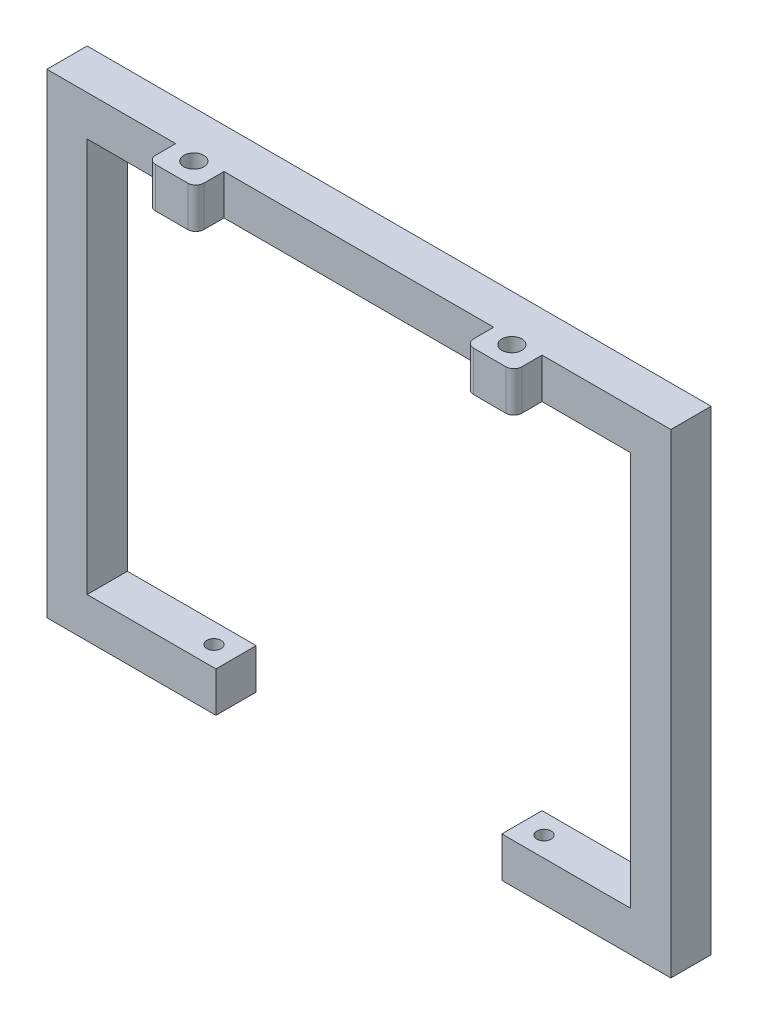
ISO-10303-21;
HEADER;
FILE_DESCRIPTION(('STEP AP214'),'2;1');
FILE_NAME('part.step','',(''),(''),'','','');
FILE_SCHEMA(('AUTOMOTIVE_DESIGN { 1 0 10303 214 1 1 1 1 }'));
ENDSEC;
DATA;
#1=APPLICATION_CONTEXT('core data for automotive mechanical design processes');
#2=APPLICATION_PROTOCOL_DEFINITION('international standard','automotive_design',2000,#1);
#3=PRODUCT_CONTEXT('',#1,'mechanical');
#4=PRODUCT('Part','Part','',(#3));
#5=PRODUCT_RELATED_PRODUCT_CATEGORY('part','',(#4));
#6=PRODUCT_DEFINITION_FORMATION('','',#4);
#7=PRODUCT_DEFINITION_CONTEXT('part definition',#1,'design');
#8=PRODUCT_DEFINITION('design','',#6,#7);
#9=PRODUCT_DEFINITION_SHAPE('','',#8);
#10=(LENGTH_UNIT() NAMED_UNIT(*) SI_UNIT(.MILLI.,.METRE.));
#11=(NAMED_UNIT(*) PLANE_ANGLE_UNIT() SI_UNIT($,.RADIAN.));
#12=(NAMED_UNIT(*) SI_UNIT($,.STERADIAN.) SOLID_ANGLE_UNIT());
#13=UNCERTAINTY_MEASURE_WITH_UNIT(LENGTH_MEASURE(1.E-05),#10,'distance_accuracy_value','');
#14=(GEOMETRIC_REPRESENTATION_CONTEXT(3) GLOBAL_UNCERTAINTY_ASSIGNED_CONTEXT((#13)) GLOBAL_UNIT_ASSIGNED_CONTEXT((#10,
#11,#12)) REPRESENTATION_CONTEXT('',''));
#15=CARTESIAN_POINT('',(0.,0.,0.));
#16=DIRECTION('',(0.,0.,1.));
#17=DIRECTION('',(1.,0.,0.));
#18=AXIS2_PLACEMENT_3D('',#15,#16,#17);
#19=CARTESIAN_POINT('',(0.,0.,10.));
#20=DIRECTION('',(0.,0.,-1.));
#21=DIRECTION('',(-1.,0.,0.));
#22=AXIS2_PLACEMENT_3D('',#19,#20,#21);
#23=PLANE('',#22);
#24=DIRECTION('',(0.,-1.,0.));
#25=VECTOR('',#24,1.);
#26=CARTESIAN_POINT('',(-10.3416428046525,73.6271966779008,10.));
#27=LINE('',#26,#25);
#28=CARTESIAN_POINT('',(-10.3416428046525,73.6271966779008,10.));
#29=VERTEX_POINT('',#28);
#30=CARTESIAN_POINT('',(-10.3416428046525,63.6271966779008,10.));
#31=VERTEX_POINT('',#30);
#32=EDGE_CURVE('E197',#29,#31,#27,.T.);
#33=ORIENTED_EDGE('',*,*,#32,.F.);
#34=DIRECTION('',(-1.,0.,0.));
#35=VECTOR('',#34,1.);
#36=CARTESIAN_POINT('',(-121.341642804653,73.6271966779008,10.));
#37=LINE('',#36,#35);
#38=CARTESIAN_POINT('',(-77.3416428046525,73.6271966779008,10.));
#39=VERTEX_POINT('',#38);
#40=EDGE_CURVE('E205',#29,#39,#37,.T.);
#41=ORIENTED_EDGE('',*,*,#40,.T.);
#42=DIRECTION('',(0.,1.,0.));
#43=VECTOR('',#42,1.);
#44=CARTESIAN_POINT('',(-77.3416428046525,73.6271966779008,10.));
#45=LINE('',#44,#43);
#46=CARTESIAN_POINT('',(-77.3416428046525,63.6271966779008,10.));
#47=VERTEX_POINT('',#46);
#48=EDGE_CURVE('E241',#47,#39,#45,.T.);
#49=ORIENTED_EDGE('',*,*,#48,.F.);
#50=DIRECTION('',(1.,0.,0.));
#51=VECTOR('',#50,1.);
#52=CARTESIAN_POINT('',(23.6583571953475,63.6271966779008,10.));
#53=LINE('',#52,#51);
#54=EDGE_CURVE('E218',#47,#31,#53,.T.);
#55=ORIENTED_EDGE('',*,*,#54,.T.);
#56=EDGE_LOOP('',(#33,#41,#49,#55));
#57=FACE_BOUND('',#56,.T.);
#58=ADVANCED_FACE('F32',(#57),#23,.F.);
#59=DIRECTION('',(0.,1.,0.));
#60=VECTOR('',#59,1.);
#61=CARTESIAN_POINT('',(1.6583571953475,73.6271966779008,10.));
#62=LINE('',#61,#60);
#63=CARTESIAN_POINT('',(1.6583571953475,63.6271966779008,10.));
#64=VERTEX_POINT('',#63);
#65=CARTESIAN_POINT('',(1.6583571953475,73.6271966779008,10.));
#66=VERTEX_POINT('',#65);
#67=EDGE_CURVE('E219',#64,#66,#62,.T.);
#68=ORIENTED_EDGE('',*,*,#67,.F.);
#69=CARTESIAN_POINT('',(23.6583571953475,63.6271966779008,10.));
#70=VERTEX_POINT('',#69);
#71=EDGE_CURVE('E314',#64,#70,#53,.T.);
#72=ORIENTED_EDGE('',*,*,#71,.T.);
#73=DIRECTION('',(0.,-1.,0.));
#74=VECTOR('',#73,1.);
#75=CARTESIAN_POINT('',(23.6583571953475,-34.3728033220992,10.));
#76=LINE('',#75,#74);
#77=CARTESIAN_POINT('',(23.6583571953475,-34.3728033220992,10.));
#78=VERTEX_POINT('',#77);
#79=EDGE_CURVE('E329',#70,#78,#76,.T.);
#80=ORIENTED_EDGE('',*,*,#79,.T.);
#81=DIRECTION('',(-1.,0.,0.));
#82=VECTOR('',#81,1.);
#83=CARTESIAN_POINT('',(-8.34164280465251,-34.3728033220992,10.));
#84=LINE('',#83,#82);
#85=CARTESIAN_POINT('',(-8.34164280465251,-34.3728033220992,10.));
#86=VERTEX_POINT('',#85);
#87=EDGE_CURVE('E418',#78,#86,#84,.T.);
#88=ORIENTED_EDGE('',*,*,#87,.T.);
#89=DIRECTION('',(0.,-1.,0.));
#90=VECTOR('',#89,1.);
#91=CARTESIAN_POINT('',(-8.34164280465251,-44.3728033220992,10.));
#92=LINE('',#91,#90);
#93=CARTESIAN_POINT('',(-8.34164280465251,-44.3728033220992,10.));
#94=VERTEX_POINT('',#93);
#95=EDGE_CURVE('E415',#86,#94,#92,.T.);
#96=ORIENTED_EDGE('',*,*,#95,.T.);
#97=DIRECTION('',(1.,0.,0.));
#98=VECTOR('',#97,1.);
#99=CARTESIAN_POINT('',(33.6583571953475,-44.3728033220992,10.));
#100=LINE('',#99,#98);
#101=CARTESIAN_POINT('',(33.6583571953475,-44.3728033220992,10.));
#102=VERTEX_POINT('',#101);
#103=EDGE_CURVE('E412',#94,#102,#100,.T.);
#104=ORIENTED_EDGE('',*,*,#103,.T.);
#105=DIRECTION('',(0.,1.,0.));
#106=VECTOR('',#105,1.);
#107=CARTESIAN_POINT('',(33.6583571953475,73.6271966779008,10.));
#108=LINE('',#107,#106);
#109=CARTESIAN_POINT('',(33.6583571953475,73.6271966779008,10.));
#110=VERTEX_POINT('',#109);
#111=EDGE_CURVE('E404',#102,#110,#108,.T.);
#112=ORIENTED_EDGE('',*,*,#111,.T.);
#113=EDGE_CURVE('E213',#110,#66,#37,.T.);
#114=ORIENTED_EDGE('',*,*,#113,.T.);
#115=EDGE_LOOP('',(#68,#72,#80,#88,#96,#104,#112,#114));
#116=FACE_BOUND('',#115,.T.);
#117=ADVANCED_FACE('F313',(#116),#23,.F.);
#118=DIRECTION('',(0.,-1.,0.));
#119=VECTOR('',#118,1.);
#120=CARTESIAN_POINT('',(-89.3416428046525,73.6271966779008,10.));
#121=LINE('',#120,#119);
#122=CARTESIAN_POINT('',(-89.3416428046525,73.6271966779008,10.));
#123=VERTEX_POINT('',#122);
#124=CARTESIAN_POINT('',(-89.3416428046525,63.6271966779008,10.));
#125=VERTEX_POINT('',#124);
#126=EDGE_CURVE('E236',#123,#125,#121,.T.);
#127=ORIENTED_EDGE('',*,*,#126,.F.);
#128=CARTESIAN_POINT('',(-121.341642804653,73.6271966779008,10.));
#129=VERTEX_POINT('',#128);
#130=EDGE_CURVE('E214',#123,#129,#37,.T.);
#131=ORIENTED_EDGE('',*,*,#130,.T.);
#132=DIRECTION('',(0.,-1.,0.));
#133=VECTOR('',#132,1.);
#134=CARTESIAN_POINT('',(-121.341642804653,-44.3728033220992,10.));
#135=LINE('',#134,#133);
#136=CARTESIAN_POINT('',(-121.341642804653,-44.3728033220992,10.));
#137=VERTEX_POINT('',#136);
#138=EDGE_CURVE('E401',#129,#137,#135,.T.);
#139=ORIENTED_EDGE('',*,*,#138,.T.);
#140=DIRECTION('',(1.,0.,0.));
#141=VECTOR('',#140,1.);
#142=CARTESIAN_POINT('',(-79.3416428046525,-44.3728033220992,10.));
#143=LINE('',#142,#141);
#144=CARTESIAN_POINT('',(-79.3416428046525,-44.3728033220992,10.));
#145=VERTEX_POINT('',#144);
#146=EDGE_CURVE('E399',#137,#145,#143,.T.);
#147=ORIENTED_EDGE('',*,*,#146,.T.);
#148=DIRECTION('',(0.,1.,0.));
#149=VECTOR('',#148,1.);
#150=CARTESIAN_POINT('',(-79.3416428046525,-34.3728033220992,10.));
#151=LINE('',#150,#149);
#152=CARTESIAN_POINT('',(-79.3416428046525,-34.3728033220992,10.));
#153=VERTEX_POINT('',#152);
#154=EDGE_CURVE('E371',#145,#153,#151,.T.);
#155=ORIENTED_EDGE('',*,*,#154,.T.);
#156=DIRECTION('',(-1.,0.,0.));
#157=VECTOR('',#156,1.);
#158=CARTESIAN_POINT('',(-111.341642804653,-34.3728033220992,10.));
#159=LINE('',#158,#157);
#160=CARTESIAN_POINT('',(-111.341642804653,-34.3728033220992,10.));
#161=VERTEX_POINT('',#160);
#162=EDGE_CURVE('E322',#153,#161,#159,.T.);
#163=ORIENTED_EDGE('',*,*,#162,.T.);
#164=DIRECTION('',(0.,1.,0.));
#165=VECTOR('',#164,1.);
#166=CARTESIAN_POINT('',(-111.341642804653,63.6271966779008,10.));
#167=LINE('',#166,#165);
#168=CARTESIAN_POINT('',(-111.341642804653,63.6271966779008,10.));
#169=VERTEX_POINT('',#168);
#170=EDGE_CURVE('E319',#161,#169,#167,.T.);
#171=ORIENTED_EDGE('',*,*,#170,.T.);
#172=EDGE_CURVE('E320',#169,#125,#53,.T.);
#173=ORIENTED_EDGE('',*,*,#172,.T.);
#174=EDGE_LOOP('',(#127,#131,#139,#147,#155,#163,#171,#173));
#175=FACE_BOUND('',#174,.T.);
#176=ADVANCED_FACE('F456',(#175),#23,.F.);
#177=CARTESIAN_POINT('',(-111.341642804653,-34.3728033220992,10.));
#178=DIRECTION('',(0.,-1.,0.));
#179=DIRECTION('',(0.,0.,-1.));
#180=AXIS2_PLACEMENT_3D('',#177,#178,#179);
#181=PLANE('',#180);
#182=CARTESIAN_POINT('',(-84.8416428046525,-34.3728033220992,5.));
#183=DIRECTION('',(0.,1.,0.));
#184=DIRECTION('',(0.,0.,1.));
#185=AXIS2_PLACEMENT_3D('',#182,#183,#184);
#186=CIRCLE('',#185,1.775);
#187=CARTESIAN_POINT('',(-84.8416428046525,-34.3728033220992,6.775));
#188=VERTEX_POINT('',#187);
#189=EDGE_CURVE('E466',#188,#188,#186,.T.);
#190=ORIENTED_EDGE('',*,*,#189,.F.);
#191=EDGE_LOOP('',(#190));
#192=FACE_BOUND('',#191,.T.);
#193=DIRECTION('',(-1.,0.,0.));
#194=VECTOR('',#193,1.);
#195=CARTESIAN_POINT('',(-111.341642804653,-34.3728033220992,0.));
#196=LINE('',#195,#194);
#197=CARTESIAN_POINT('',(-79.3416428046525,-34.3728033220992,0.));
#198=VERTEX_POINT('',#197);
#199=CARTESIAN_POINT('',(-111.341642804653,-34.3728033220992,0.));
#200=VERTEX_POINT('',#199);
#201=EDGE_CURVE('E394',#198,#200,#196,.T.);
#202=ORIENTED_EDGE('',*,*,#201,.T.);
#203=DIRECTION('',(0.,0.,-1.));
#204=VECTOR('',#203,1.);
#205=CARTESIAN_POINT('',(-111.341642804653,-34.3728033220992,10.));
#206=LINE('',#205,#204);
#207=EDGE_CURVE('E337',#161,#200,#206,.T.);
#208=ORIENTED_EDGE('',*,*,#207,.F.);
#209=ORIENTED_EDGE('',*,*,#162,.F.);
#210=DIRECTION('',(0.,0.,-1.));
#211=VECTOR('',#210,1.);
#212=CARTESIAN_POINT('',(-79.3416428046525,-34.3728033220992,10.));
#213=LINE('',#212,#211);
#214=EDGE_CURVE('E368',#153,#198,#213,.T.);
#215=ORIENTED_EDGE('',*,*,#214,.T.);
#216=EDGE_LOOP('',(#202,#208,#209,#215));
#217=FACE_BOUND('',#216,.T.);
#218=ADVANCED_FACE('F464',(#192,#217),#181,.F.);
#219=CARTESIAN_POINT('',(-111.341642804653,63.6271966779008,10.));
#220=DIRECTION('',(-1.,0.,0.));
#221=DIRECTION('',(0.,0.,1.));
#222=AXIS2_PLACEMENT_3D('',#219,#220,#221);
#223=PLANE('',#222);
#224=DIRECTION('',(0.,1.,0.));
#225=VECTOR('',#224,1.);
#226=CARTESIAN_POINT('',(-111.341642804653,63.6271966779008,0.));
#227=LINE('',#226,#225);
#228=CARTESIAN_POINT('',(-111.341642804653,63.6271966779008,0.));
#229=VERTEX_POINT('',#228);
#230=EDGE_CURVE('E392',#200,#229,#227,.T.);
#231=ORIENTED_EDGE('',*,*,#230,.T.);
#232=DIRECTION('',(0.,0.,-1.));
#233=VECTOR('',#232,1.);
#234=CARTESIAN_POINT('',(-111.341642804653,63.6271966779008,10.));
#235=LINE('',#234,#233);
#236=EDGE_CURVE('E340',#169,#229,#235,.T.);
#237=ORIENTED_EDGE('',*,*,#236,.F.);
#238=ORIENTED_EDGE('',*,*,#170,.F.);
#239=ORIENTED_EDGE('',*,*,#207,.T.);
#240=EDGE_LOOP('',(#231,#237,#238,#239));
#241=FACE_BOUND('',#240,.T.);
#242=ADVANCED_FACE('F504',(#241),#223,.F.);
#243=CARTESIAN_POINT('',(23.6583571953475,63.6271966779008,10.));
#244=DIRECTION('',(0.,1.,0.));
#245=DIRECTION('',(0.,0.,1.));
#246=AXIS2_PLACEMENT_3D('',#243,#244,#245);
#247=PLANE('',#246);
#248=CARTESIAN_POINT('',(-4.34164280465249,63.6271966779008,11.5));
#249=DIRECTION('',(0.,1.,0.));
#250=DIRECTION('',(0.,0.,1.));
#251=AXIS2_PLACEMENT_3D('',#248,#249,#250);
#252=CIRCLE('',#251,2.47979840310108);
#253=CARTESIAN_POINT('',(-4.34164280465249,63.6271966779008,13.9797984031011));
#254=VERTEX_POINT('',#253);
#255=EDGE_CURVE('E760',#254,#254,#252,.F.);
#256=ORIENTED_EDGE('',*,*,#255,.F.);
#257=EDGE_LOOP('',(#256));
#258=FACE_BOUND('',#257,.T.);
#259=CARTESIAN_POINT('',(-83.3416428046525,63.6271966779008,11.5));
#260=DIRECTION('',(0.,1.,0.));
#261=DIRECTION('',(0.,0.,1.));
#262=AXIS2_PLACEMENT_3D('',#259,#260,#261);
#263=CIRCLE('',#262,2.47979840310108);
#264=CARTESIAN_POINT('',(-83.3416428046525,63.6271966779008,13.9797984031011));
#265=VERTEX_POINT('',#264);
#266=EDGE_CURVE('E220',#265,#265,#263,.F.);
#267=ORIENTED_EDGE('',*,*,#266,.F.);
#268=EDGE_LOOP('',(#267));
#269=FACE_BOUND('',#268,.T.);
#270=DIRECTION('',(0.,0.,-1.));
#271=VECTOR('',#270,1.);
#272=CARTESIAN_POINT('',(1.6583571953475,63.6271966779008,17.));
#273=LINE('',#272,#271);
#274=CARTESIAN_POINT('',(1.6583571953475,63.6271966779008,15.));
#275=VERTEX_POINT('',#274);
#276=EDGE_CURVE('E232',#275,#64,#273,.T.);
#277=ORIENTED_EDGE('',*,*,#276,.F.);
#278=CARTESIAN_POINT('',(-0.341642804652501,63.6271966779008,15.));
#279=DIRECTION('',(0.,1.,0.));
#280=DIRECTION('',(0.,0.,1.));
#281=AXIS2_PLACEMENT_3D('',#278,#279,#280);
#282=CIRCLE('',#281,2.);
#283=CARTESIAN_POINT('',(-0.341642804652501,63.6271966779008,17.));
#284=VERTEX_POINT('',#283);
#285=EDGE_CURVE('E40',#275,#284,#282,.F.);
#286=ORIENTED_EDGE('',*,*,#285,.T.);
#287=DIRECTION('',(1.,0.,0.));
#288=VECTOR('',#287,1.);
#289=CARTESIAN_POINT('',(-10.3416428046525,63.6271966779008,17.));
#290=LINE('',#289,#288);
#291=CARTESIAN_POINT('',(-8.3416428046525,63.6271966779008,17.));
#292=VERTEX_POINT('',#291);
#293=EDGE_CURVE('E223',#292,#284,#290,.T.);
#294=ORIENTED_EDGE('',*,*,#293,.F.);
#295=CARTESIAN_POINT('',(-8.3416428046525,63.6271966779008,15.));
#296=DIRECTION('',(0.,1.,0.));
#297=DIRECTION('',(0.,0.,1.));
#298=AXIS2_PLACEMENT_3D('',#295,#296,#297);
#299=CIRCLE('',#298,2.);
#300=CARTESIAN_POINT('',(-10.3416428046525,63.6271966779008,15.));
#301=VERTEX_POINT('',#300);
#302=EDGE_CURVE('E47',#292,#301,#299,.F.);
#303=ORIENTED_EDGE('',*,*,#302,.T.);
#304=DIRECTION('',(0.,0.,-1.));
#305=VECTOR('',#304,1.);
#306=CARTESIAN_POINT('',(-10.3416428046525,63.6271966779008,17.));
#307=LINE('',#306,#305);
#308=EDGE_CURVE('E234',#301,#31,#307,.T.);
#309=ORIENTED_EDGE('',*,*,#308,.T.);
#310=ORIENTED_EDGE('',*,*,#54,.F.);
#311=DIRECTION('',(0.,0.,-1.));
#312=VECTOR('',#311,1.);
#313=CARTESIAN_POINT('',(-77.3416428046525,63.6271966779008,17.));
#314=LINE('',#313,#312);
#315=CARTESIAN_POINT('',(-77.3416428046525,63.6271966779008,15.));
#316=VERTEX_POINT('',#315);
#317=EDGE_CURVE('E265',#316,#47,#314,.T.);
#318=ORIENTED_EDGE('',*,*,#317,.F.);
#319=CARTESIAN_POINT('',(-79.3416428046525,63.6271966779008,15.));
#320=DIRECTION('',(0.,1.,0.));
#321=DIRECTION('',(0.,0.,1.));
#322=AXIS2_PLACEMENT_3D('',#319,#320,#321);
#323=CIRCLE('',#322,2.);
#324=CARTESIAN_POINT('',(-79.3416428046525,63.6271966779008,17.));
#325=VERTEX_POINT('',#324);
#326=EDGE_CURVE('E282',#316,#325,#323,.F.);
#327=ORIENTED_EDGE('',*,*,#326,.T.);
#328=DIRECTION('',(1.,0.,0.));
#329=VECTOR('',#328,1.);
#330=CARTESIAN_POINT('',(-89.3416428046525,63.6271966779008,17.));
#331=LINE('',#330,#329);
#332=CARTESIAN_POINT('',(-87.3416428046525,63.6271966779008,17.));
#333=VERTEX_POINT('',#332);
#334=EDGE_CURVE('E237',#333,#325,#331,.T.);
#335=ORIENTED_EDGE('',*,*,#334,.F.);
#336=CARTESIAN_POINT('',(-87.3416428046525,63.6271966779008,15.));
#337=DIRECTION('',(0.,1.,0.));
#338=DIRECTION('',(0.,0.,1.));
#339=AXIS2_PLACEMENT_3D('',#336,#337,#338);
#340=CIRCLE('',#339,2.);
#341=CARTESIAN_POINT('',(-89.3416428046525,63.6271966779008,15.));
#342=VERTEX_POINT('',#341);
#343=EDGE_CURVE('E278',#333,#342,#340,.F.);
#344=ORIENTED_EDGE('',*,*,#343,.T.);
#345=DIRECTION('',(0.,0.,-1.));
#346=VECTOR('',#345,1.);
#347=CARTESIAN_POINT('',(-89.3416428046525,63.6271966779008,17.));
#348=LINE('',#347,#346);
#349=EDGE_CURVE('E274',#342,#125,#348,.T.);
#350=ORIENTED_EDGE('',*,*,#349,.T.);
#351=ORIENTED_EDGE('',*,*,#172,.F.);
#352=ORIENTED_EDGE('',*,*,#236,.T.);
#353=DIRECTION('',(1.,0.,0.));
#354=VECTOR('',#353,1.);
#355=CARTESIAN_POINT('',(23.6583571953475,63.6271966779008,0.));
#356=LINE('',#355,#354);
#357=CARTESIAN_POINT('',(23.6583571953475,63.6271966779008,0.));
#358=VERTEX_POINT('',#357);
#359=EDGE_CURVE('E390',#229,#358,#356,.T.);
#360=ORIENTED_EDGE('',*,*,#359,.T.);
#361=DIRECTION('',(0.,0.,-1.));
#362=VECTOR('',#361,1.);
#363=CARTESIAN_POINT('',(23.6583571953475,63.6271966779008,10.));
#364=LINE('',#363,#362);
#365=EDGE_CURVE('E317',#70,#358,#364,.T.);
#366=ORIENTED_EDGE('',*,*,#365,.F.);
#367=ORIENTED_EDGE('',*,*,#71,.F.);
#368=EDGE_LOOP('',(#277,#286,#294,#303,#309,#310,#318,#327,#335,#344,#350,#351,#352,#360,#366,#367));
#369=FACE_BOUND('',#368,.T.);
#370=ADVANCED_FACE('F299',(#258,#269,#369),#247,.F.);
#371=CARTESIAN_POINT('',(23.6583571953475,-34.3728033220992,10.));
#372=DIRECTION('',(1.,0.,0.));
#373=DIRECTION('',(0.,0.,-1.));
#374=AXIS2_PLACEMENT_3D('',#371,#372,#373);
#375=PLANE('',#374);
#376=DIRECTION('',(0.,-1.,0.));
#377=VECTOR('',#376,1.);
#378=CARTESIAN_POINT('',(23.6583571953475,-34.3728033220992,0.));
#379=LINE('',#378,#377);
#380=CARTESIAN_POINT('',(23.6583571953475,-34.3728033220992,0.));
#381=VERTEX_POINT('',#380);
#382=EDGE_CURVE('E388',#358,#381,#379,.T.);
#383=ORIENTED_EDGE('',*,*,#382,.T.);
#384=DIRECTION('',(0.,0.,-1.));
#385=VECTOR('',#384,1.);
#386=CARTESIAN_POINT('',(23.6583571953475,-34.3728033220992,10.));
#387=LINE('',#386,#385);
#388=EDGE_CURVE('E344',#78,#381,#387,.T.);
#389=ORIENTED_EDGE('',*,*,#388,.F.);
#390=ORIENTED_EDGE('',*,*,#79,.F.);
#391=ORIENTED_EDGE('',*,*,#365,.T.);
#392=EDGE_LOOP('',(#383,#389,#390,#391));
#393=FACE_BOUND('',#392,.T.);
#394=ADVANCED_FACE('F424',(#393),#375,.F.);
#395=CARTESIAN_POINT('',(-8.34164280465251,-34.3728033220992,10.));
#396=DIRECTION('',(0.,-1.,0.));
#397=DIRECTION('',(0.,0.,-1.));
#398=AXIS2_PLACEMENT_3D('',#395,#396,#397);
#399=PLANE('',#398);
#400=CARTESIAN_POINT('',(-2.8416428046525,-34.3728033220992,5.));
#401=DIRECTION('',(0.,1.,0.));
#402=DIRECTION('',(0.,0.,1.));
#403=AXIS2_PLACEMENT_3D('',#400,#401,#402);
#404=CIRCLE('',#403,1.775);
#405=CARTESIAN_POINT('',(-2.8416428046525,-34.3728033220992,6.775));
#406=VERTEX_POINT('',#405);
#407=EDGE_CURVE('E280',#406,#406,#404,.T.);
#408=ORIENTED_EDGE('',*,*,#407,.F.);
#409=EDGE_LOOP('',(#408));
#410=FACE_BOUND('',#409,.T.);
#411=DIRECTION('',(-1.,0.,0.));
#412=VECTOR('',#411,1.);
#413=CARTESIAN_POINT('',(-8.34164280465251,-34.3728033220992,0.));
#414=LINE('',#413,#412);
#415=CARTESIAN_POINT('',(-8.34164280465251,-34.3728033220992,0.));
#416=VERTEX_POINT('',#415);
#417=EDGE_CURVE('E386',#381,#416,#414,.T.);
#418=ORIENTED_EDGE('',*,*,#417,.T.);
#419=DIRECTION('',(0.,0.,-1.));
#420=VECTOR('',#419,1.);
#421=CARTESIAN_POINT('',(-8.34164280465251,-34.3728033220992,10.));
#422=LINE('',#421,#420);
#423=EDGE_CURVE('E347',#86,#416,#422,.T.);
#424=ORIENTED_EDGE('',*,*,#423,.F.);
#425=ORIENTED_EDGE('',*,*,#87,.F.);
#426=ORIENTED_EDGE('',*,*,#388,.T.);
#427=EDGE_LOOP('',(#418,#424,#425,#426));
#428=FACE_BOUND('',#427,.T.);
#429=ADVANCED_FACE('F428',(#410,#428),#399,.F.);
#430=CARTESIAN_POINT('',(-8.34164280465251,-44.3728033220992,10.));
#431=DIRECTION('',(1.,0.,0.));
#432=DIRECTION('',(0.,0.,-1.));
#433=AXIS2_PLACEMENT_3D('',#430,#431,#432);
#434=PLANE('',#433);
#435=DIRECTION('',(0.,-1.,0.));
#436=VECTOR('',#435,1.);
#437=CARTESIAN_POINT('',(-8.34164280465251,-44.3728033220992,0.));
#438=LINE('',#437,#436);
#439=CARTESIAN_POINT('',(-8.34164280465251,-44.3728033220992,0.));
#440=VERTEX_POINT('',#439);
#441=EDGE_CURVE('E384',#416,#440,#438,.T.);
#442=ORIENTED_EDGE('',*,*,#441,.T.);
#443=DIRECTION('',(0.,0.,-1.));
#444=VECTOR('',#443,1.);
#445=CARTESIAN_POINT('',(-8.34164280465251,-44.3728033220992,10.));
#446=LINE('',#445,#444);
#447=EDGE_CURVE('E350',#94,#440,#446,.T.);
#448=ORIENTED_EDGE('',*,*,#447,.F.);
#449=ORIENTED_EDGE('',*,*,#95,.F.);
#450=ORIENTED_EDGE('',*,*,#423,.T.);
#451=EDGE_LOOP('',(#442,#448,#449,#450));
#452=FACE_BOUND('',#451,.T.);
#453=ADVANCED_FACE('F433',(#452),#434,.F.);
#454=CARTESIAN_POINT('',(33.6583571953475,-44.3728033220992,10.));
#455=DIRECTION('',(0.,1.,0.));
#456=DIRECTION('',(0.,0.,1.));
#457=AXIS2_PLACEMENT_3D('',#454,#455,#456);
#458=PLANE('',#457);
#459=CARTESIAN_POINT('',(-2.8416428046525,-44.3728033220992,5.));
#460=DIRECTION('',(0.,1.,0.));
#461=DIRECTION('',(0.,0.,1.));
#462=AXIS2_PLACEMENT_3D('',#459,#460,#461);
#463=CIRCLE('',#462,1.775);
#464=CARTESIAN_POINT('',(-2.8416428046525,-44.3728033220992,6.775));
#465=VERTEX_POINT('',#464);
#466=EDGE_CURVE('E469',#465,#465,#463,.T.);
#467=ORIENTED_EDGE('',*,*,#466,.T.);
#468=EDGE_LOOP('',(#467));
#469=FACE_BOUND('',#468,.T.);
#470=DIRECTION('',(1.,0.,0.));
#471=VECTOR('',#470,1.);
#472=CARTESIAN_POINT('',(33.6583571953475,-44.3728033220992,0.));
#473=LINE('',#472,#471);
#474=CARTESIAN_POINT('',(33.6583571953475,-44.3728033220992,0.));
#475=VERTEX_POINT('',#474);
#476=EDGE_CURVE('E382',#440,#475,#473,.T.);
#477=ORIENTED_EDGE('',*,*,#476,.T.);
#478=DIRECTION('',(0.,0.,-1.));
#479=VECTOR('',#478,1.);
#480=CARTESIAN_POINT('',(33.6583571953475,-44.3728033220992,10.));
#481=LINE('',#480,#479);
#482=EDGE_CURVE('E353',#102,#475,#481,.T.);
#483=ORIENTED_EDGE('',*,*,#482,.F.);
#484=ORIENTED_EDGE('',*,*,#103,.F.);
#485=ORIENTED_EDGE('',*,*,#447,.T.);
#486=EDGE_LOOP('',(#477,#483,#484,#485));
#487=FACE_BOUND('',#486,.T.);
#488=ADVANCED_FACE('F436',(#469,#487),#458,.F.);
#489=CARTESIAN_POINT('',(33.6583571953475,73.6271966779008,10.));
#490=DIRECTION('',(-1.,0.,0.));
#491=DIRECTION('',(0.,-1.,0.));
#492=AXIS2_PLACEMENT_3D('',#489,#490,#491);
#493=PLANE('',#492);
#494=DIRECTION('',(0.,1.,0.));
#495=VECTOR('',#494,1.);
#496=CARTESIAN_POINT('',(33.6583571953475,73.6271966779008,0.));
#497=LINE('',#496,#495);
#498=CARTESIAN_POINT('',(33.6583571953475,73.6271966779008,0.));
#499=VERTEX_POINT('',#498);
#500=EDGE_CURVE('E380',#475,#499,#497,.T.);
#501=ORIENTED_EDGE('',*,*,#500,.T.);
#502=DIRECTION('',(0.,0.,-1.));
#503=VECTOR('',#502,1.);
#504=CARTESIAN_POINT('',(33.6583571953475,73.6271966779008,10.));
#505=LINE('',#504,#503);
#506=EDGE_CURVE('E356',#110,#499,#505,.T.);
#507=ORIENTED_EDGE('',*,*,#506,.F.);
#508=ORIENTED_EDGE('',*,*,#111,.F.);
#509=ORIENTED_EDGE('',*,*,#482,.T.);
#510=EDGE_LOOP('',(#501,#507,#508,#509));
#511=FACE_BOUND('',#510,.T.);
#512=ADVANCED_FACE('F439',(#511),#493,.F.);
#513=CARTESIAN_POINT('',(-121.341642804653,73.6271966779008,10.));
#514=DIRECTION('',(0.,-1.,0.));
#515=DIRECTION('',(0.,0.,-1.));
#516=AXIS2_PLACEMENT_3D('',#513,#514,#515);
#517=PLANE('',#516);
#518=CARTESIAN_POINT('',(-4.34164280465249,73.6271966779008,11.5));
#519=DIRECTION('',(0.,1.,0.));
#520=DIRECTION('',(0.,0.,1.));
#521=AXIS2_PLACEMENT_3D('',#518,#519,#520);
#522=CIRCLE('',#521,2.47979840310108);
#523=CARTESIAN_POINT('',(-4.34164280465249,73.6271966779008,13.9797984031011));
#524=VERTEX_POINT('',#523);
#525=EDGE_CURVE('E763',#524,#524,#522,.T.);
#526=ORIENTED_EDGE('',*,*,#525,.F.);
#527=EDGE_LOOP('',(#526));
#528=FACE_BOUND('',#527,.T.);
#529=CARTESIAN_POINT('',(-83.3416428046525,73.6271966779008,11.5));
#530=DIRECTION('',(0.,1.,0.));
#531=DIRECTION('',(0.,0.,1.));
#532=AXIS2_PLACEMENT_3D('',#529,#530,#531);
#533=CIRCLE('',#532,2.47979840310108);
#534=CARTESIAN_POINT('',(-83.3416428046525,73.6271966779008,13.9797984031011));
#535=VERTEX_POINT('',#534);
#536=EDGE_CURVE('E226',#535,#535,#533,.T.);
#537=ORIENTED_EDGE('',*,*,#536,.F.);
#538=EDGE_LOOP('',(#537));
#539=FACE_BOUND('',#538,.T.);
#540=DIRECTION('',(-1.,0.,0.));
#541=VECTOR('',#540,1.);
#542=CARTESIAN_POINT('',(-10.3416428046525,73.6271966779008,17.));
#543=LINE('',#542,#541);
#544=CARTESIAN_POINT('',(-0.341642804652501,73.6271966779008,17.));
#545=VERTEX_POINT('',#544);
#546=CARTESIAN_POINT('',(-8.3416428046525,73.6271966779008,17.));
#547=VERTEX_POINT('',#546);
#548=EDGE_CURVE('E202',#545,#547,#543,.T.);
#549=ORIENTED_EDGE('',*,*,#548,.F.);
#550=CARTESIAN_POINT('',(-0.3416428046525,73.6271966779008,15.));
#551=DIRECTION('',(0.,-1.,0.));
#552=DIRECTION('',(0.,0.,-1.));
#553=AXIS2_PLACEMENT_3D('',#550,#551,#552);
#554=CIRCLE('',#553,2.);
#555=CARTESIAN_POINT('',(1.6583571953475,73.6271966779008,15.));
#556=VERTEX_POINT('',#555);
#557=EDGE_CURVE('E294',#545,#556,#554,.F.);
#558=ORIENTED_EDGE('',*,*,#557,.T.);
#559=DIRECTION('',(0.,0.,-1.));
#560=VECTOR('',#559,1.);
#561=CARTESIAN_POINT('',(1.6583571953475,73.6271966779008,17.));
#562=LINE('',#561,#560);
#563=EDGE_CURVE('E201',#556,#66,#562,.T.);
#564=ORIENTED_EDGE('',*,*,#563,.T.);
#565=ORIENTED_EDGE('',*,*,#113,.F.);
#566=ORIENTED_EDGE('',*,*,#506,.T.);
#567=DIRECTION('',(-1.,0.,0.));
#568=VECTOR('',#567,1.);
#569=CARTESIAN_POINT('',(-121.341642804653,73.6271966779008,0.));
#570=LINE('',#569,#568);
#571=CARTESIAN_POINT('',(-121.341642804653,73.6271966779008,0.));
#572=VERTEX_POINT('',#571);
#573=EDGE_CURVE('E378',#499,#572,#570,.T.);
#574=ORIENTED_EDGE('',*,*,#573,.T.);
#575=DIRECTION('',(0.,0.,-1.));
#576=VECTOR('',#575,1.);
#577=CARTESIAN_POINT('',(-121.341642804653,73.6271966779008,10.));
#578=LINE('',#577,#576);
#579=EDGE_CURVE('E359',#129,#572,#578,.T.);
#580=ORIENTED_EDGE('',*,*,#579,.F.);
#581=ORIENTED_EDGE('',*,*,#130,.F.);
#582=DIRECTION('',(0.,0.,-1.));
#583=VECTOR('',#582,1.);
#584=CARTESIAN_POINT('',(-89.3416428046525,73.6271966779008,17.));
#585=LINE('',#584,#583);
#586=CARTESIAN_POINT('',(-89.3416428046525,73.6271966779008,15.));
#587=VERTEX_POINT('',#586);
#588=EDGE_CURVE('E244',#587,#123,#585,.T.);
#589=ORIENTED_EDGE('',*,*,#588,.F.);
#590=CARTESIAN_POINT('',(-87.3416428046525,73.6271966779008,15.));
#591=DIRECTION('',(0.,-1.,0.));
#592=DIRECTION('',(0.,0.,-1.));
#593=AXIS2_PLACEMENT_3D('',#590,#591,#592);
#594=CIRCLE('',#593,2.);
#595=CARTESIAN_POINT('',(-87.3416428046525,73.6271966779008,17.));
#596=VERTEX_POINT('',#595);
#597=EDGE_CURVE('E266',#587,#596,#594,.F.);
#598=ORIENTED_EDGE('',*,*,#597,.T.);
#599=DIRECTION('',(-1.,0.,0.));
#600=VECTOR('',#599,1.);
#601=CARTESIAN_POINT('',(-89.3416428046525,73.6271966779008,17.));
#602=LINE('',#601,#600);
#603=CARTESIAN_POINT('',(-79.3416428046525,73.6271966779008,17.));
#604=VERTEX_POINT('',#603);
#605=EDGE_CURVE('E240',#604,#596,#602,.T.);
#606=ORIENTED_EDGE('',*,*,#605,.F.);
#607=CARTESIAN_POINT('',(-79.3416428046525,73.6271966779008,15.));
#608=DIRECTION('',(0.,-1.,0.));
#609=DIRECTION('',(0.,0.,-1.));
#610=AXIS2_PLACEMENT_3D('',#607,#608,#609);
#611=CIRCLE('',#610,2.);
#612=CARTESIAN_POINT('',(-77.3416428046525,73.6271966779008,15.));
#613=VERTEX_POINT('',#612);
#614=EDGE_CURVE('E275',#604,#613,#611,.F.);
#615=ORIENTED_EDGE('',*,*,#614,.T.);
#616=DIRECTION('',(0.,0.,-1.));
#617=VECTOR('',#616,1.);
#618=CARTESIAN_POINT('',(-77.3416428046525,73.6271966779008,17.));
#619=LINE('',#618,#617);
#620=EDGE_CURVE('E209',#613,#39,#619,.T.);
#621=ORIENTED_EDGE('',*,*,#620,.T.);
#622=ORIENTED_EDGE('',*,*,#40,.F.);
#623=DIRECTION('',(0.,0.,-1.));
#624=VECTOR('',#623,1.);
#625=CARTESIAN_POINT('',(-10.3416428046525,73.6271966779008,17.));
#626=LINE('',#625,#624);
#627=CARTESIAN_POINT('',(-10.3416428046525,73.6271966779008,15.));
#628=VERTEX_POINT('',#627);
#629=EDGE_CURVE('E193',#628,#29,#626,.T.);
#630=ORIENTED_EDGE('',*,*,#629,.F.);
#631=CARTESIAN_POINT('',(-8.3416428046525,73.6271966779008,15.));
#632=DIRECTION('',(0.,-1.,0.));
#633=DIRECTION('',(0.,0.,-1.));
#634=AXIS2_PLACEMENT_3D('',#631,#632,#633);
#635=CIRCLE('',#634,2.);
#636=EDGE_CURVE('E292',#628,#547,#635,.F.);
#637=ORIENTED_EDGE('',*,*,#636,.T.);
#638=EDGE_LOOP('',(#549,#558,#564,#565,#566,#574,#580,#581,#589,#598,#606,#615,#621,#622,#630,#637));
#639=FACE_BOUND('',#638,.T.);
#640=ADVANCED_FACE('F207',(#528,#539,#639),#517,.F.);
#641=CARTESIAN_POINT('',(-121.341642804653,-44.3728033220992,10.));
#642=DIRECTION('',(1.,0.,0.));
#643=DIRECTION('',(0.,0.,-1.));
#644=AXIS2_PLACEMENT_3D('',#641,#642,#643);
#645=PLANE('',#644);
#646=DIRECTION('',(0.,-1.,0.));
#647=VECTOR('',#646,1.);
#648=CARTESIAN_POINT('',(-121.341642804653,-44.3728033220992,0.));
#649=LINE('',#648,#647);
#650=CARTESIAN_POINT('',(-121.341642804653,-44.3728033220992,0.));
#651=VERTEX_POINT('',#650);
#652=EDGE_CURVE('E376',#572,#651,#649,.T.);
#653=ORIENTED_EDGE('',*,*,#652,.T.);
#654=DIRECTION('',(0.,0.,-1.));
#655=VECTOR('',#654,1.);
#656=CARTESIAN_POINT('',(-121.341642804653,-44.3728033220992,10.));
#657=LINE('',#656,#655);
#658=EDGE_CURVE('E362',#137,#651,#657,.T.);
#659=ORIENTED_EDGE('',*,*,#658,.F.);
#660=ORIENTED_EDGE('',*,*,#138,.F.);
#661=ORIENTED_EDGE('',*,*,#579,.T.);
#662=EDGE_LOOP('',(#653,#659,#660,#661));
#663=FACE_BOUND('',#662,.T.);
#664=ADVANCED_FACE('F449',(#663),#645,.F.);
#665=CARTESIAN_POINT('',(-79.3416428046525,-44.3728033220992,10.));
#666=DIRECTION('',(0.,1.,0.));
#667=DIRECTION('',(0.,0.,1.));
#668=AXIS2_PLACEMENT_3D('',#665,#666,#667);
#669=PLANE('',#668);
#670=CARTESIAN_POINT('',(-84.8416428046525,-44.3728033220992,5.));
#671=DIRECTION('',(0.,1.,0.));
#672=DIRECTION('',(0.,0.,1.));
#673=AXIS2_PLACEMENT_3D('',#670,#671,#672);
#674=CIRCLE('',#673,1.775);
#675=CARTESIAN_POINT('',(-84.8416428046525,-44.3728033220992,6.775));
#676=VERTEX_POINT('',#675);
#677=EDGE_CURVE('E397',#676,#676,#674,.T.);
#678=ORIENTED_EDGE('',*,*,#677,.T.);
#679=EDGE_LOOP('',(#678));
#680=FACE_BOUND('',#679,.T.);
#681=DIRECTION('',(1.,0.,0.));
#682=VECTOR('',#681,1.);
#683=CARTESIAN_POINT('',(-79.3416428046525,-44.3728033220992,0.));
#684=LINE('',#683,#682);
#685=CARTESIAN_POINT('',(-79.3416428046525,-44.3728033220992,0.));
#686=VERTEX_POINT('',#685);
#687=EDGE_CURVE('E374',#651,#686,#684,.T.);
#688=ORIENTED_EDGE('',*,*,#687,.T.);
#689=DIRECTION('',(0.,0.,-1.));
#690=VECTOR('',#689,1.);
#691=CARTESIAN_POINT('',(-79.3416428046525,-44.3728033220992,10.));
#692=LINE('',#691,#690);
#693=EDGE_CURVE('E365',#145,#686,#692,.T.);
#694=ORIENTED_EDGE('',*,*,#693,.F.);
#695=ORIENTED_EDGE('',*,*,#146,.F.);
#696=ORIENTED_EDGE('',*,*,#658,.T.);
#697=EDGE_LOOP('',(#688,#694,#695,#696));
#698=FACE_BOUND('',#697,.T.);
#699=ADVANCED_FACE('F453',(#680,#698),#669,.F.);
#700=CARTESIAN_POINT('',(-79.3416428046525,-34.3728033220992,10.));
#701=DIRECTION('',(-1.,0.,0.));
#702=DIRECTION('',(0.,0.,1.));
#703=AXIS2_PLACEMENT_3D('',#700,#701,#702);
#704=PLANE('',#703);
#705=DIRECTION('',(0.,1.,0.));
#706=VECTOR('',#705,1.);
#707=CARTESIAN_POINT('',(-79.3416428046525,-34.3728033220992,0.));
#708=LINE('',#707,#706);
#709=EDGE_CURVE('E372',#686,#198,#708,.T.);
#710=ORIENTED_EDGE('',*,*,#709,.T.);
#711=ORIENTED_EDGE('',*,*,#214,.F.);
#712=ORIENTED_EDGE('',*,*,#154,.F.);
#713=ORIENTED_EDGE('',*,*,#693,.T.);
#714=EDGE_LOOP('',(#710,#711,#712,#713));
#715=FACE_BOUND('',#714,.T.);
#716=ADVANCED_FACE('F462',(#715),#704,.F.);
#717=CARTESIAN_POINT('',(0.,0.,0.));
#718=DIRECTION('',(0.,0.,-1.));
#719=DIRECTION('',(-1.,0.,0.));
#720=AXIS2_PLACEMENT_3D('',#717,#718,#719);
#721=PLANE('',#720);
#722=ORIENTED_EDGE('',*,*,#201,.F.);
#723=ORIENTED_EDGE('',*,*,#709,.F.);
#724=ORIENTED_EDGE('',*,*,#687,.F.);
#725=ORIENTED_EDGE('',*,*,#652,.F.);
#726=ORIENTED_EDGE('',*,*,#573,.F.);
#727=ORIENTED_EDGE('',*,*,#500,.F.);
#728=ORIENTED_EDGE('',*,*,#476,.F.);
#729=ORIENTED_EDGE('',*,*,#441,.F.);
#730=ORIENTED_EDGE('',*,*,#417,.F.);
#731=ORIENTED_EDGE('',*,*,#382,.F.);
#732=ORIENTED_EDGE('',*,*,#359,.F.);
#733=ORIENTED_EDGE('',*,*,#230,.F.);
#734=EDGE_LOOP('',(#722,#723,#724,#725,#726,#727,#728,#729,#730,#731,#732,#733));
#735=FACE_BOUND('',#734,.T.);
#736=ADVANCED_FACE('F444',(#735),#721,.T.);
#737=CARTESIAN_POINT('',(-84.8416428046525,-44.3728033220992,5.));
#738=DIRECTION('',(0.,1.,0.));
#739=DIRECTION('',(0.,0.,1.));
#740=AXIS2_PLACEMENT_3D('',#737,#738,#739);
#741=CYLINDRICAL_SURFACE('',#740,1.775);
#742=ORIENTED_EDGE('',*,*,#677,.F.);
#743=EDGE_LOOP('',(#742));
#744=FACE_BOUND('',#743,.T.);
#745=ORIENTED_EDGE('',*,*,#189,.T.);
#746=EDGE_LOOP('',(#745));
#747=FACE_BOUND('',#746,.T.);
#748=ADVANCED_FACE('F481',(#744,#747),#741,.F.);
#749=CARTESIAN_POINT('',(-2.8416428046525,-44.3728033220992,5.));
#750=DIRECTION('',(0.,1.,0.));
#751=DIRECTION('',(0.,0.,1.));
#752=AXIS2_PLACEMENT_3D('',#749,#750,#751);
#753=CYLINDRICAL_SURFACE('',#752,1.775);
#754=ORIENTED_EDGE('',*,*,#466,.F.);
#755=EDGE_LOOP('',(#754));
#756=FACE_BOUND('',#755,.T.);
#757=ORIENTED_EDGE('',*,*,#407,.T.);
#758=EDGE_LOOP('',(#757));
#759=FACE_BOUND('',#758,.T.);
#760=ADVANCED_FACE('F477',(#756,#759),#753,.F.);
#761=CARTESIAN_POINT('',(-89.3416428046525,73.6271966779008,17.));
#762=DIRECTION('',(1.,0.,0.));
#763=DIRECTION('',(0.,0.,-1.));
#764=AXIS2_PLACEMENT_3D('',#761,#762,#763);
#765=PLANE('',#764);
#766=ORIENTED_EDGE('',*,*,#349,.F.);
#767=DIRECTION('',(0.,-1.,0.));
#768=VECTOR('',#767,1.);
#769=CARTESIAN_POINT('',(-89.3416428046525,73.6271966779008,15.));
#770=LINE('',#769,#768);
#771=EDGE_CURVE('E284',#342,#587,#770,.F.);
#772=ORIENTED_EDGE('',*,*,#771,.T.);
#773=ORIENTED_EDGE('',*,*,#588,.T.);
#774=ORIENTED_EDGE('',*,*,#126,.T.);
#775=EDGE_LOOP('',(#766,#772,#773,#774));
#776=FACE_BOUND('',#775,.T.);
#777=ADVANCED_FACE('F480',(#776),#765,.F.);
#778=CARTESIAN_POINT('',(-77.3416428046525,73.6271966779008,17.));
#779=DIRECTION('',(-1.,0.,0.));
#780=DIRECTION('',(0.,-1.,0.));
#781=AXIS2_PLACEMENT_3D('',#778,#779,#780);
#782=PLANE('',#781);
#783=ORIENTED_EDGE('',*,*,#620,.F.);
#784=DIRECTION('',(0.,1.,0.));
#785=VECTOR('',#784,1.);
#786=CARTESIAN_POINT('',(-77.3416428046525,63.6271966779008,15.));
#787=LINE('',#786,#785);
#788=EDGE_CURVE('E276',#613,#316,#787,.F.);
#789=ORIENTED_EDGE('',*,*,#788,.T.);
#790=ORIENTED_EDGE('',*,*,#317,.T.);
#791=ORIENTED_EDGE('',*,*,#48,.T.);
#792=EDGE_LOOP('',(#783,#789,#790,#791));
#793=FACE_BOUND('',#792,.T.);
#794=ADVANCED_FACE('F607',(#793),#782,.F.);
#795=CARTESIAN_POINT('',(0.,0.,17.));
#796=DIRECTION('',(0.,0.,1.));
#797=DIRECTION('',(1.,0.,0.));
#798=AXIS2_PLACEMENT_3D('',#795,#796,#797);
#799=PLANE('',#798);
#800=ORIENTED_EDGE('',*,*,#334,.T.);
#801=DIRECTION('',(0.,1.,0.));
#802=VECTOR('',#801,1.);
#803=CARTESIAN_POINT('',(-79.3416428046525,73.6271966779008,17.));
#804=LINE('',#803,#802);
#805=EDGE_CURVE('E261',#325,#604,#804,.T.);
#806=ORIENTED_EDGE('',*,*,#805,.T.);
#807=ORIENTED_EDGE('',*,*,#605,.T.);
#808=DIRECTION('',(0.,-1.,0.));
#809=VECTOR('',#808,1.);
#810=CARTESIAN_POINT('',(-87.3416428046525,63.6271966779008,17.));
#811=LINE('',#810,#809);
#812=EDGE_CURVE('E325',#596,#333,#811,.T.);
#813=ORIENTED_EDGE('',*,*,#812,.T.);
#814=EDGE_LOOP('',(#800,#806,#807,#813));
#815=FACE_BOUND('',#814,.T.);
#816=ADVANCED_FACE('F563',(#815),#799,.T.);
#817=CARTESIAN_POINT('',(-10.3416428046525,73.6271966779008,17.));
#818=DIRECTION('',(1.,0.,0.));
#819=DIRECTION('',(0.,1.,0.));
#820=AXIS2_PLACEMENT_3D('',#817,#818,#819);
#821=PLANE('',#820);
#822=ORIENTED_EDGE('',*,*,#308,.F.);
#823=DIRECTION('',(0.,-1.,0.));
#824=VECTOR('',#823,1.);
#825=CARTESIAN_POINT('',(-10.3416428046525,73.6271966779008,15.));
#826=LINE('',#825,#824);
#827=EDGE_CURVE('E11',#301,#628,#826,.F.);
#828=ORIENTED_EDGE('',*,*,#827,.T.);
#829=ORIENTED_EDGE('',*,*,#629,.T.);
#830=ORIENTED_EDGE('',*,*,#32,.T.);
#831=EDGE_LOOP('',(#822,#828,#829,#830));
#832=FACE_BOUND('',#831,.T.);
#833=ADVANCED_FACE('F195',(#832),#821,.F.);
#834=CARTESIAN_POINT('',(1.6583571953475,73.6271966779008,17.));
#835=DIRECTION('',(-1.,0.,0.));
#836=DIRECTION('',(0.,-1.,0.));
#837=AXIS2_PLACEMENT_3D('',#834,#835,#836);
#838=PLANE('',#837);
#839=ORIENTED_EDGE('',*,*,#563,.F.);
#840=DIRECTION('',(0.,1.,0.));
#841=VECTOR('',#840,1.);
#842=CARTESIAN_POINT('',(1.6583571953475,63.6271966779008,15.));
#843=LINE('',#842,#841);
#844=EDGE_CURVE('E55',#556,#275,#843,.F.);
#845=ORIENTED_EDGE('',*,*,#844,.T.);
#846=ORIENTED_EDGE('',*,*,#276,.T.);
#847=ORIENTED_EDGE('',*,*,#67,.T.);
#848=EDGE_LOOP('',(#839,#845,#846,#847));
#849=FACE_BOUND('',#848,.T.);
#850=ADVANCED_FACE('F310',(#849),#838,.F.);
#851=CARTESIAN_POINT('',(0.,0.,17.));
#852=DIRECTION('',(0.,0.,1.));
#853=DIRECTION('',(1.,0.,0.));
#854=AXIS2_PLACEMENT_3D('',#851,#852,#853);
#855=PLANE('',#854);
#856=ORIENTED_EDGE('',*,*,#293,.T.);
#857=DIRECTION('',(0.,1.,0.));
#858=VECTOR('',#857,1.);
#859=CARTESIAN_POINT('',(-0.3416428046525,73.6271966779008,17.));
#860=LINE('',#859,#858);
#861=EDGE_CURVE('E289',#284,#545,#860,.T.);
#862=ORIENTED_EDGE('',*,*,#861,.T.);
#863=ORIENTED_EDGE('',*,*,#548,.T.);
#864=DIRECTION('',(0.,-1.,0.));
#865=VECTOR('',#864,1.);
#866=CARTESIAN_POINT('',(-8.3416428046525,63.6271966779008,17.));
#867=LINE('',#866,#865);
#868=EDGE_CURVE('E286',#547,#292,#867,.T.);
#869=ORIENTED_EDGE('',*,*,#868,.T.);
#870=EDGE_LOOP('',(#856,#862,#863,#869));
#871=FACE_BOUND('',#870,.T.);
#872=ADVANCED_FACE('F304',(#871),#855,.T.);
#873=CARTESIAN_POINT('',(-83.3416428046525,56.6132676106674,11.5));
#874=DIRECTION('',(0.,1.,0.));
#875=DIRECTION('',(0.,0.,1.));
#876=AXIS2_PLACEMENT_3D('',#873,#874,#875);
#877=CYLINDRICAL_SURFACE('',#876,2.47979840310108);
#878=ORIENTED_EDGE('',*,*,#266,.T.);
#879=EDGE_LOOP('',(#878));
#880=FACE_BOUND('',#879,.T.);
#881=ORIENTED_EDGE('',*,*,#536,.T.);
#882=EDGE_LOOP('',(#881));
#883=FACE_BOUND('',#882,.T.);
#884=ADVANCED_FACE('F544',(#880,#883),#877,.F.);
#885=CARTESIAN_POINT('',(-4.34164280465249,56.6132676106674,11.5));
#886=DIRECTION('',(0.,1.,0.));
#887=DIRECTION('',(0.,0.,1.));
#888=AXIS2_PLACEMENT_3D('',#885,#886,#887);
#889=CYLINDRICAL_SURFACE('',#888,2.47979840310108);
#890=ORIENTED_EDGE('',*,*,#255,.T.);
#891=EDGE_LOOP('',(#890));
#892=FACE_BOUND('',#891,.T.);
#893=ORIENTED_EDGE('',*,*,#525,.T.);
#894=EDGE_LOOP('',(#893));
#895=FACE_BOUND('',#894,.T.);
#896=ADVANCED_FACE('F519',(#892,#895),#889,.F.);
#897=CARTESIAN_POINT('',(-79.3416428046526,1.10108648316638E-13,15.));
#898=DIRECTION('',(0.,-1.,0.));
#899=DIRECTION('',(1.,0.,0.));
#900=AXIS2_PLACEMENT_3D('',#897,#898,#899);
#901=CYLINDRICAL_SURFACE('',#900,2.);
#902=ORIENTED_EDGE('',*,*,#326,.F.);
#903=ORIENTED_EDGE('',*,*,#788,.F.);
#904=ORIENTED_EDGE('',*,*,#614,.F.);
#905=ORIENTED_EDGE('',*,*,#805,.F.);
#906=EDGE_LOOP('',(#902,#903,#904,#905));
#907=FACE_BOUND('',#906,.T.);
#908=ADVANCED_FACE('F515',(#907),#901,.T.);
#909=CARTESIAN_POINT('',(-87.3416428046525,0.,15.));
#910=DIRECTION('',(0.,1.,0.));
#911=DIRECTION('',(0.,0.,1.));
#912=AXIS2_PLACEMENT_3D('',#909,#910,#911);
#913=CYLINDRICAL_SURFACE('',#912,2.);
#914=ORIENTED_EDGE('',*,*,#597,.F.);
#915=ORIENTED_EDGE('',*,*,#771,.F.);
#916=ORIENTED_EDGE('',*,*,#343,.F.);
#917=ORIENTED_EDGE('',*,*,#812,.F.);
#918=EDGE_LOOP('',(#914,#915,#916,#917));
#919=FACE_BOUND('',#918,.T.);
#920=ADVANCED_FACE('F518',(#919),#913,.T.);
#921=CARTESIAN_POINT('',(-0.341642804652506,0.,15.));
#922=DIRECTION('',(0.,-1.,0.));
#923=DIRECTION('',(1.,0.,0.));
#924=AXIS2_PLACEMENT_3D('',#921,#922,#923);
#925=CYLINDRICAL_SURFACE('',#924,2.);
#926=ORIENTED_EDGE('',*,*,#285,.F.);
#927=ORIENTED_EDGE('',*,*,#844,.F.);
#928=ORIENTED_EDGE('',*,*,#557,.F.);
#929=ORIENTED_EDGE('',*,*,#861,.F.);
#930=EDGE_LOOP('',(#926,#927,#928,#929));
#931=FACE_BOUND('',#930,.T.);
#932=ADVANCED_FACE('F307',(#931),#925,.T.);
#933=CARTESIAN_POINT('',(-8.34164280465249,0.,15.));
#934=DIRECTION('',(0.,1.,0.));
#935=DIRECTION('',(-1.,0.,0.));
#936=AXIS2_PLACEMENT_3D('',#933,#934,#935);
#937=CYLINDRICAL_SURFACE('',#936,2.);
#938=ORIENTED_EDGE('',*,*,#636,.F.);
#939=ORIENTED_EDGE('',*,*,#827,.F.);
#940=ORIENTED_EDGE('',*,*,#302,.F.);
#941=ORIENTED_EDGE('',*,*,#868,.F.);
#942=EDGE_LOOP('',(#938,#939,#940,#941));
#943=FACE_BOUND('',#942,.T.);
#944=ADVANCED_FACE('F34',(#943),#937,.T.);
#945=CLOSED_SHELL('',(#58,#117,#176,#218,#242,#370,#394,#429,#453,#488,#512,#640,#664,#699,#716,
#736,#748,#760,#777,#794,#816,#833,#850,#872,#884,#896,#908,#920,#932,#944));
#946=MANIFOLD_SOLID_BREP('B2',#945);
#947=ADVANCED_BREP_SHAPE_REPRESENTATION('',(#18,#946),#14);
#948=SHAPE_DEFINITION_REPRESENTATION(#9,#947);
ENDSEC;
END-ISO-10303-21;
